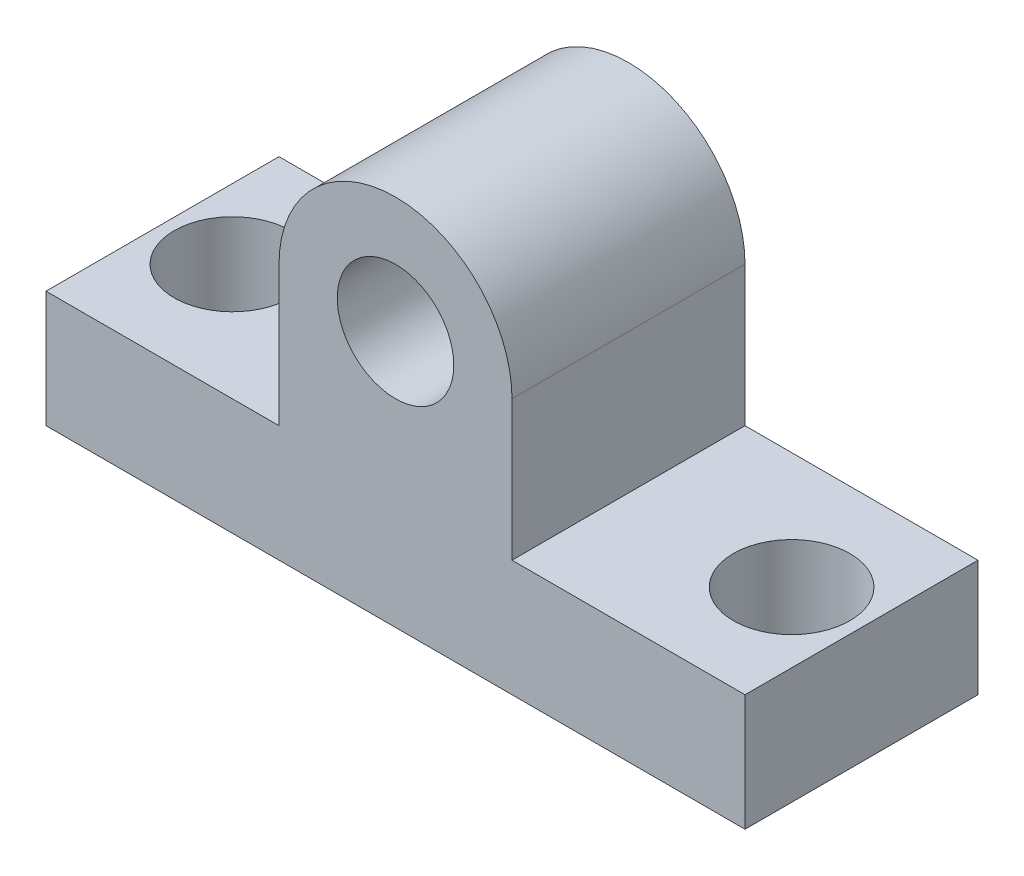
ISO-10303-21;
HEADER;
FILE_DESCRIPTION(('STEP AP214'),'2;1');
FILE_NAME('part.step','',(''),(''),'','','');
FILE_SCHEMA(('AUTOMOTIVE_DESIGN { 1 0 10303 214 1 1 1 1 }'));
ENDSEC;
DATA;
#1=APPLICATION_CONTEXT('core data for automotive mechanical design processes');
#2=APPLICATION_PROTOCOL_DEFINITION('international standard','automotive_design',2000,#1);
#3=PRODUCT_CONTEXT('',#1,'mechanical');
#4=PRODUCT('Part','Part','',(#3));
#5=PRODUCT_RELATED_PRODUCT_CATEGORY('part','',(#4));
#6=PRODUCT_DEFINITION_FORMATION('','',#4);
#7=PRODUCT_DEFINITION_CONTEXT('part definition',#1,'design');
#8=PRODUCT_DEFINITION('design','',#6,#7);
#9=PRODUCT_DEFINITION_SHAPE('','',#8);
#10=(LENGTH_UNIT() NAMED_UNIT(*) SI_UNIT(.MILLI.,.METRE.));
#11=(NAMED_UNIT(*) PLANE_ANGLE_UNIT() SI_UNIT($,.RADIAN.));
#12=(NAMED_UNIT(*) SI_UNIT($,.STERADIAN.) SOLID_ANGLE_UNIT());
#13=UNCERTAINTY_MEASURE_WITH_UNIT(LENGTH_MEASURE(1.E-05),#10,'distance_accuracy_value','');
#14=(GEOMETRIC_REPRESENTATION_CONTEXT(3) GLOBAL_UNCERTAINTY_ASSIGNED_CONTEXT((#13)) GLOBAL_UNIT_ASSIGNED_CONTEXT((#10,
#11,#12)) REPRESENTATION_CONTEXT('',''));
#15=CARTESIAN_POINT('',(0.,0.,0.));
#16=DIRECTION('',(0.,0.,1.));
#17=DIRECTION('',(1.,0.,0.));
#18=AXIS2_PLACEMENT_3D('',#15,#16,#17);
#19=CARTESIAN_POINT('',(0.,6.,10.));
#20=DIRECTION('',(0.,0.,1.));
#21=DIRECTION('',(1.,0.,0.));
#22=AXIS2_PLACEMENT_3D('',#19,#20,#21);
#23=PLANE('',#22);
#24=DIRECTION('',(0.,1.,0.));
#25=VECTOR('',#24,1.);
#26=CARTESIAN_POINT('',(15.,0.,10.));
#27=LINE('',#26,#25);
#28=CARTESIAN_POINT('',(15.,-5.,10.));
#29=VERTEX_POINT('',#28);
#30=CARTESIAN_POINT('',(15.,0.,10.));
#31=VERTEX_POINT('',#30);
#32=EDGE_CURVE('E176',#29,#31,#27,.T.);
#33=ORIENTED_EDGE('',*,*,#32,.T.);
#34=DIRECTION('',(-1.,0.,0.));
#35=VECTOR('',#34,1.);
#36=CARTESIAN_POINT('',(5.,0.,10.));
#37=LINE('',#36,#35);
#38=CARTESIAN_POINT('',(5.,0.,10.));
#39=VERTEX_POINT('',#38);
#40=EDGE_CURVE('E112',#31,#39,#37,.T.);
#41=ORIENTED_EDGE('',*,*,#40,.T.);
#42=DIRECTION('',(0.,1.,0.));
#43=VECTOR('',#42,1.);
#44=CARTESIAN_POINT('',(5.,6.,10.));
#45=LINE('',#44,#43);
#46=CARTESIAN_POINT('',(5.,6.,10.));
#47=VERTEX_POINT('',#46);
#48=EDGE_CURVE('E197',#39,#47,#45,.T.);
#49=ORIENTED_EDGE('',*,*,#48,.T.);
#50=CARTESIAN_POINT('',(0.,6.,10.));
#51=DIRECTION('',(0.,0.,1.));
#52=DIRECTION('',(1.,0.,0.));
#53=AXIS2_PLACEMENT_3D('',#50,#51,#52);
#54=CIRCLE('',#53,5.);
#55=CARTESIAN_POINT('',(-5.,6.,10.));
#56=VERTEX_POINT('',#55);
#57=EDGE_CURVE('E211',#47,#56,#54,.T.);
#58=ORIENTED_EDGE('',*,*,#57,.T.);
#59=DIRECTION('',(0.,-1.,0.));
#60=VECTOR('',#59,1.);
#61=CARTESIAN_POINT('',(-5.,6.,10.));
#62=LINE('',#61,#60);
#63=CARTESIAN_POINT('',(-5.,0.,10.));
#64=VERTEX_POINT('',#63);
#65=EDGE_CURVE('E131',#56,#64,#62,.T.);
#66=ORIENTED_EDGE('',*,*,#65,.T.);
#67=DIRECTION('',(-1.,0.,0.));
#68=VECTOR('',#67,1.);
#69=CARTESIAN_POINT('',(-5.,0.,10.));
#70=LINE('',#69,#68);
#71=CARTESIAN_POINT('',(-15.,0.,10.));
#72=VERTEX_POINT('',#71);
#73=EDGE_CURVE('E125',#64,#72,#70,.T.);
#74=ORIENTED_EDGE('',*,*,#73,.T.);
#75=DIRECTION('',(0.,-1.,0.));
#76=VECTOR('',#75,1.);
#77=CARTESIAN_POINT('',(-15.,0.,10.));
#78=LINE('',#77,#76);
#79=CARTESIAN_POINT('',(-15.,-5.,10.));
#80=VERTEX_POINT('',#79);
#81=EDGE_CURVE('E129',#72,#80,#78,.T.);
#82=ORIENTED_EDGE('',*,*,#81,.T.);
#83=DIRECTION('',(1.,0.,0.));
#84=VECTOR('',#83,1.);
#85=CARTESIAN_POINT('',(15.,-5.,10.));
#86=LINE('',#85,#84);
#87=EDGE_CURVE('E69',#80,#29,#86,.T.);
#88=ORIENTED_EDGE('',*,*,#87,.T.);
#89=EDGE_LOOP('',(#33,#41,#49,#58,#66,#74,#82,#88));
#90=FACE_BOUND('',#89,.T.);
#91=CARTESIAN_POINT('',(0.,6.,10.));
#92=DIRECTION('',(0.,0.,1.));
#93=DIRECTION('',(1.,0.,0.));
#94=AXIS2_PLACEMENT_3D('',#91,#92,#93);
#95=CIRCLE('',#94,2.5);
#96=CARTESIAN_POINT('',(2.5,6.,10.));
#97=VERTEX_POINT('',#96);
#98=EDGE_CURVE('E158',#97,#97,#95,.T.);
#99=ORIENTED_EDGE('',*,*,#98,.F.);
#100=EDGE_LOOP('',(#99));
#101=FACE_BOUND('',#100,.T.);
#102=ADVANCED_FACE('F51',(#90,#101),#23,.T.);
#103=CARTESIAN_POINT('',(0.,6.,0.));
#104=DIRECTION('',(0.,0.,1.));
#105=DIRECTION('',(1.,0.,0.));
#106=AXIS2_PLACEMENT_3D('',#103,#104,#105);
#107=PLANE('',#106);
#108=DIRECTION('',(0.,1.,0.));
#109=VECTOR('',#108,1.);
#110=CARTESIAN_POINT('',(15.,0.,0.));
#111=LINE('',#110,#109);
#112=CARTESIAN_POINT('',(15.,-5.,0.));
#113=VERTEX_POINT('',#112);
#114=CARTESIAN_POINT('',(15.,0.,0.));
#115=VERTEX_POINT('',#114);
#116=EDGE_CURVE('E153',#113,#115,#111,.T.);
#117=ORIENTED_EDGE('',*,*,#116,.F.);
#118=DIRECTION('',(1.,0.,0.));
#119=VECTOR('',#118,1.);
#120=CARTESIAN_POINT('',(15.,-5.,0.));
#121=LINE('',#120,#119);
#122=CARTESIAN_POINT('',(-15.,-5.,0.));
#123=VERTEX_POINT('',#122);
#124=EDGE_CURVE('E104',#123,#113,#121,.T.);
#125=ORIENTED_EDGE('',*,*,#124,.F.);
#126=DIRECTION('',(0.,-1.,0.));
#127=VECTOR('',#126,1.);
#128=CARTESIAN_POINT('',(-15.,0.,0.));
#129=LINE('',#128,#127);
#130=CARTESIAN_POINT('',(-15.,0.,0.));
#131=VERTEX_POINT('',#130);
#132=EDGE_CURVE('E98',#131,#123,#129,.T.);
#133=ORIENTED_EDGE('',*,*,#132,.F.);
#134=DIRECTION('',(-1.,0.,0.));
#135=VECTOR('',#134,1.);
#136=CARTESIAN_POINT('',(-5.,0.,0.));
#137=LINE('',#136,#135);
#138=CARTESIAN_POINT('',(-5.,0.,0.));
#139=VERTEX_POINT('',#138);
#140=EDGE_CURVE('E140',#139,#131,#137,.T.);
#141=ORIENTED_EDGE('',*,*,#140,.F.);
#142=DIRECTION('',(0.,-1.,0.));
#143=VECTOR('',#142,1.);
#144=CARTESIAN_POINT('',(-5.,6.,0.));
#145=LINE('',#144,#143);
#146=CARTESIAN_POINT('',(-5.,6.,0.));
#147=VERTEX_POINT('',#146);
#148=EDGE_CURVE('E167',#147,#139,#145,.T.);
#149=ORIENTED_EDGE('',*,*,#148,.F.);
#150=CARTESIAN_POINT('',(0.,6.,0.));
#151=DIRECTION('',(0.,0.,1.));
#152=DIRECTION('',(1.,0.,0.));
#153=AXIS2_PLACEMENT_3D('',#150,#151,#152);
#154=CIRCLE('',#153,5.);
#155=CARTESIAN_POINT('',(5.,6.,0.));
#156=VERTEX_POINT('',#155);
#157=EDGE_CURVE('E164',#156,#147,#154,.T.);
#158=ORIENTED_EDGE('',*,*,#157,.F.);
#159=DIRECTION('',(0.,1.,0.));
#160=VECTOR('',#159,1.);
#161=CARTESIAN_POINT('',(5.,6.,0.));
#162=LINE('',#161,#160);
#163=CARTESIAN_POINT('',(5.,0.,0.));
#164=VERTEX_POINT('',#163);
#165=EDGE_CURVE('E161',#164,#156,#162,.T.);
#166=ORIENTED_EDGE('',*,*,#165,.F.);
#167=DIRECTION('',(-1.,0.,0.));
#168=VECTOR('',#167,1.);
#169=CARTESIAN_POINT('',(5.,0.,0.));
#170=LINE('',#169,#168);
#171=EDGE_CURVE('E157',#115,#164,#170,.T.);
#172=ORIENTED_EDGE('',*,*,#171,.F.);
#173=EDGE_LOOP('',(#117,#125,#133,#141,#149,#158,#166,#172));
#174=FACE_BOUND('',#173,.T.);
#175=CARTESIAN_POINT('',(0.,6.,0.));
#176=DIRECTION('',(0.,0.,1.));
#177=DIRECTION('',(1.,0.,0.));
#178=AXIS2_PLACEMENT_3D('',#175,#176,#177);
#179=CIRCLE('',#178,2.5);
#180=CARTESIAN_POINT('',(2.5,6.,0.));
#181=VERTEX_POINT('',#180);
#182=EDGE_CURVE('E221',#181,#181,#179,.T.);
#183=ORIENTED_EDGE('',*,*,#182,.T.);
#184=EDGE_LOOP('',(#183));
#185=FACE_BOUND('',#184,.T.);
#186=ADVANCED_FACE('F201',(#174,#185),#107,.F.);
#187=CARTESIAN_POINT('',(15.,0.,10.));
#188=DIRECTION('',(-1.,0.,0.));
#189=DIRECTION('',(0.,0.,1.));
#190=AXIS2_PLACEMENT_3D('',#187,#188,#189);
#191=PLANE('',#190);
#192=ORIENTED_EDGE('',*,*,#116,.T.);
#193=DIRECTION('',(0.,0.,-1.));
#194=VECTOR('',#193,1.);
#195=CARTESIAN_POINT('',(15.,0.,10.));
#196=LINE('',#195,#194);
#197=EDGE_CURVE('E13',#31,#115,#196,.T.);
#198=ORIENTED_EDGE('',*,*,#197,.F.);
#199=ORIENTED_EDGE('',*,*,#32,.F.);
#200=DIRECTION('',(0.,0.,-1.));
#201=VECTOR('',#200,1.);
#202=CARTESIAN_POINT('',(15.,-5.,10.));
#203=LINE('',#202,#201);
#204=EDGE_CURVE('E149',#29,#113,#203,.T.);
#205=ORIENTED_EDGE('',*,*,#204,.T.);
#206=EDGE_LOOP('',(#192,#198,#199,#205));
#207=FACE_BOUND('',#206,.T.);
#208=ADVANCED_FACE('F53',(#207),#191,.F.);
#209=CARTESIAN_POINT('',(5.,0.,10.));
#210=DIRECTION('',(0.,-1.,0.));
#211=DIRECTION('',(1.,0.,0.));
#212=AXIS2_PLACEMENT_3D('',#209,#210,#211);
#213=PLANE('',#212);
#214=CARTESIAN_POINT('',(12.,0.,5.));
#215=DIRECTION('',(0.,1.,0.));
#216=DIRECTION('',(-1.,0.,0.));
#217=AXIS2_PLACEMENT_3D('',#214,#215,#216);
#218=CIRCLE('',#217,2.5);
#219=CARTESIAN_POINT('',(9.5,0.,5.));
#220=VERTEX_POINT('',#219);
#221=EDGE_CURVE('E237',#220,#220,#218,.T.);
#222=ORIENTED_EDGE('',*,*,#221,.F.);
#223=EDGE_LOOP('',(#222));
#224=FACE_BOUND('',#223,.T.);
#225=ORIENTED_EDGE('',*,*,#171,.T.);
#226=DIRECTION('',(0.,0.,-1.));
#227=VECTOR('',#226,1.);
#228=CARTESIAN_POINT('',(5.,0.,10.));
#229=LINE('',#228,#227);
#230=EDGE_CURVE('E61',#39,#164,#229,.T.);
#231=ORIENTED_EDGE('',*,*,#230,.F.);
#232=ORIENTED_EDGE('',*,*,#40,.F.);
#233=ORIENTED_EDGE('',*,*,#197,.T.);
#234=EDGE_LOOP('',(#225,#231,#232,#233));
#235=FACE_BOUND('',#234,.T.);
#236=ADVANCED_FACE('F255',(#224,#235),#213,.F.);
#237=CARTESIAN_POINT('',(5.,6.,10.));
#238=DIRECTION('',(-1.,0.,0.));
#239=DIRECTION('',(0.,-1.,0.));
#240=AXIS2_PLACEMENT_3D('',#237,#238,#239);
#241=PLANE('',#240);
#242=ORIENTED_EDGE('',*,*,#165,.T.);
#243=DIRECTION('',(0.,0.,-1.));
#244=VECTOR('',#243,1.);
#245=CARTESIAN_POINT('',(5.,6.,10.));
#246=LINE('',#245,#244);
#247=EDGE_CURVE('E187',#47,#156,#246,.T.);
#248=ORIENTED_EDGE('',*,*,#247,.F.);
#249=ORIENTED_EDGE('',*,*,#48,.F.);
#250=ORIENTED_EDGE('',*,*,#230,.T.);
#251=EDGE_LOOP('',(#242,#248,#249,#250));
#252=FACE_BOUND('',#251,.T.);
#253=ADVANCED_FACE('F195',(#252),#241,.F.);
#254=CARTESIAN_POINT('',(0.,6.,10.));
#255=DIRECTION('',(0.,0.,-1.));
#256=DIRECTION('',(-1.,0.,0.));
#257=AXIS2_PLACEMENT_3D('',#254,#255,#256);
#258=CYLINDRICAL_SURFACE('',#257,5.);
#259=ORIENTED_EDGE('',*,*,#157,.T.);
#260=DIRECTION('',(0.,0.,-1.));
#261=VECTOR('',#260,1.);
#262=CARTESIAN_POINT('',(-5.,6.,10.));
#263=LINE('',#262,#261);
#264=EDGE_CURVE('E183',#56,#147,#263,.T.);
#265=ORIENTED_EDGE('',*,*,#264,.F.);
#266=ORIENTED_EDGE('',*,*,#57,.F.);
#267=ORIENTED_EDGE('',*,*,#247,.T.);
#268=EDGE_LOOP('',(#259,#265,#266,#267));
#269=FACE_BOUND('',#268,.T.);
#270=ADVANCED_FACE('F206',(#269),#258,.T.);
#271=CARTESIAN_POINT('',(-5.,6.,10.));
#272=DIRECTION('',(1.,0.,0.));
#273=DIRECTION('',(0.,1.,0.));
#274=AXIS2_PLACEMENT_3D('',#271,#272,#273);
#275=PLANE('',#274);
#276=ORIENTED_EDGE('',*,*,#148,.T.);
#277=DIRECTION('',(0.,0.,-1.));
#278=VECTOR('',#277,1.);
#279=CARTESIAN_POINT('',(-5.,0.,10.));
#280=LINE('',#279,#278);
#281=EDGE_CURVE('E142',#64,#139,#280,.T.);
#282=ORIENTED_EDGE('',*,*,#281,.F.);
#283=ORIENTED_EDGE('',*,*,#65,.F.);
#284=ORIENTED_EDGE('',*,*,#264,.T.);
#285=EDGE_LOOP('',(#276,#282,#283,#284));
#286=FACE_BOUND('',#285,.T.);
#287=ADVANCED_FACE('F209',(#286),#275,.F.);
#288=CARTESIAN_POINT('',(-5.,0.,10.));
#289=DIRECTION('',(0.,-1.,0.));
#290=DIRECTION('',(1.,0.,0.));
#291=AXIS2_PLACEMENT_3D('',#288,#289,#290);
#292=PLANE('',#291);
#293=CARTESIAN_POINT('',(-12.,0.,5.));
#294=DIRECTION('',(0.,1.,0.));
#295=DIRECTION('',(-1.,0.,0.));
#296=AXIS2_PLACEMENT_3D('',#293,#294,#295);
#297=CIRCLE('',#296,2.5);
#298=CARTESIAN_POINT('',(-14.5,0.,5.));
#299=VERTEX_POINT('',#298);
#300=EDGE_CURVE('E229',#299,#299,#297,.T.);
#301=ORIENTED_EDGE('',*,*,#300,.F.);
#302=EDGE_LOOP('',(#301));
#303=FACE_BOUND('',#302,.T.);
#304=ORIENTED_EDGE('',*,*,#140,.T.);
#305=DIRECTION('',(0.,0.,-1.));
#306=VECTOR('',#305,1.);
#307=CARTESIAN_POINT('',(-15.,0.,10.));
#308=LINE('',#307,#306);
#309=EDGE_CURVE('E137',#72,#131,#308,.T.);
#310=ORIENTED_EDGE('',*,*,#309,.F.);
#311=ORIENTED_EDGE('',*,*,#73,.F.);
#312=ORIENTED_EDGE('',*,*,#281,.T.);
#313=EDGE_LOOP('',(#304,#310,#311,#312));
#314=FACE_BOUND('',#313,.T.);
#315=ADVANCED_FACE('F138',(#303,#314),#292,.F.);
#316=CARTESIAN_POINT('',(-15.,0.,10.));
#317=DIRECTION('',(1.,0.,0.));
#318=DIRECTION('',(0.,0.,-1.));
#319=AXIS2_PLACEMENT_3D('',#316,#317,#318);
#320=PLANE('',#319);
#321=ORIENTED_EDGE('',*,*,#132,.T.);
#322=DIRECTION('',(0.,0.,-1.));
#323=VECTOR('',#322,1.);
#324=CARTESIAN_POINT('',(-15.,-5.,10.));
#325=LINE('',#324,#323);
#326=EDGE_CURVE('E143',#80,#123,#325,.T.);
#327=ORIENTED_EDGE('',*,*,#326,.F.);
#328=ORIENTED_EDGE('',*,*,#81,.F.);
#329=ORIENTED_EDGE('',*,*,#309,.T.);
#330=EDGE_LOOP('',(#321,#327,#328,#329));
#331=FACE_BOUND('',#330,.T.);
#332=ADVANCED_FACE('F145',(#331),#320,.F.);
#333=CARTESIAN_POINT('',(15.,-5.,10.));
#334=DIRECTION('',(0.,1.,0.));
#335=DIRECTION('',(0.,0.,1.));
#336=AXIS2_PLACEMENT_3D('',#333,#334,#335);
#337=PLANE('',#336);
#338=CARTESIAN_POINT('',(12.,-5.,5.));
#339=DIRECTION('',(0.,1.,0.));
#340=DIRECTION('',(-1.,0.,0.));
#341=AXIS2_PLACEMENT_3D('',#338,#339,#340);
#342=CIRCLE('',#341,2.5);
#343=CARTESIAN_POINT('',(9.5,-5.,5.));
#344=VERTEX_POINT('',#343);
#345=EDGE_CURVE('E233',#344,#344,#342,.T.);
#346=ORIENTED_EDGE('',*,*,#345,.T.);
#347=EDGE_LOOP('',(#346));
#348=FACE_BOUND('',#347,.T.);
#349=CARTESIAN_POINT('',(-12.,-5.,5.));
#350=DIRECTION('',(0.,1.,0.));
#351=DIRECTION('',(-1.,0.,0.));
#352=AXIS2_PLACEMENT_3D('',#349,#350,#351);
#353=CIRCLE('',#352,2.5);
#354=CARTESIAN_POINT('',(-14.5,-5.,5.));
#355=VERTEX_POINT('',#354);
#356=EDGE_CURVE('E225',#355,#355,#353,.T.);
#357=ORIENTED_EDGE('',*,*,#356,.T.);
#358=EDGE_LOOP('',(#357));
#359=FACE_BOUND('',#358,.T.);
#360=ORIENTED_EDGE('',*,*,#124,.T.);
#361=ORIENTED_EDGE('',*,*,#204,.F.);
#362=ORIENTED_EDGE('',*,*,#87,.F.);
#363=ORIENTED_EDGE('',*,*,#326,.T.);
#364=EDGE_LOOP('',(#360,#361,#362,#363));
#365=FACE_BOUND('',#364,.T.);
#366=ADVANCED_FACE('F245',(#348,#359,#365),#337,.F.);
#367=CARTESIAN_POINT('',(0.,6.,10.));
#368=DIRECTION('',(0.,0.,-1.));
#369=DIRECTION('',(-1.,0.,0.));
#370=AXIS2_PLACEMENT_3D('',#367,#368,#369);
#371=CYLINDRICAL_SURFACE('',#370,2.5);
#372=ORIENTED_EDGE('',*,*,#98,.T.);
#373=EDGE_LOOP('',(#372));
#374=FACE_BOUND('',#373,.T.);
#375=ORIENTED_EDGE('',*,*,#182,.F.);
#376=EDGE_LOOP('',(#375));
#377=FACE_BOUND('',#376,.T.);
#378=ADVANCED_FACE('F261',(#374,#377),#371,.F.);
#379=CARTESIAN_POINT('',(-12.,-5.,5.));
#380=DIRECTION('',(0.,1.,0.));
#381=DIRECTION('',(-1.,0.,0.));
#382=AXIS2_PLACEMENT_3D('',#379,#380,#381);
#383=CYLINDRICAL_SURFACE('',#382,2.5);
#384=ORIENTED_EDGE('',*,*,#356,.F.);
#385=EDGE_LOOP('',(#384));
#386=FACE_BOUND('',#385,.T.);
#387=ORIENTED_EDGE('',*,*,#300,.T.);
#388=EDGE_LOOP('',(#387));
#389=FACE_BOUND('',#388,.T.);
#390=ADVANCED_FACE('F251',(#386,#389),#383,.F.);
#391=CARTESIAN_POINT('',(12.,-5.,5.));
#392=DIRECTION('',(0.,1.,0.));
#393=DIRECTION('',(-1.,0.,0.));
#394=AXIS2_PLACEMENT_3D('',#391,#392,#393);
#395=CYLINDRICAL_SURFACE('',#394,2.5);
#396=ORIENTED_EDGE('',*,*,#345,.F.);
#397=EDGE_LOOP('',(#396));
#398=FACE_BOUND('',#397,.T.);
#399=ORIENTED_EDGE('',*,*,#221,.T.);
#400=EDGE_LOOP('',(#399));
#401=FACE_BOUND('',#400,.T.);
#402=ADVANCED_FACE('F248',(#398,#401),#395,.F.);
#403=CLOSED_SHELL('',(#102,#186,#208,#236,#253,#270,#287,#315,#332,#366,#378,#390,#402));
#404=MANIFOLD_SOLID_BREP('B2',#403);
#405=ADVANCED_BREP_SHAPE_REPRESENTATION('',(#18,#404),#14);
#406=SHAPE_DEFINITION_REPRESENTATION(#9,#405);
ENDSEC;
END-ISO-10303-21;
